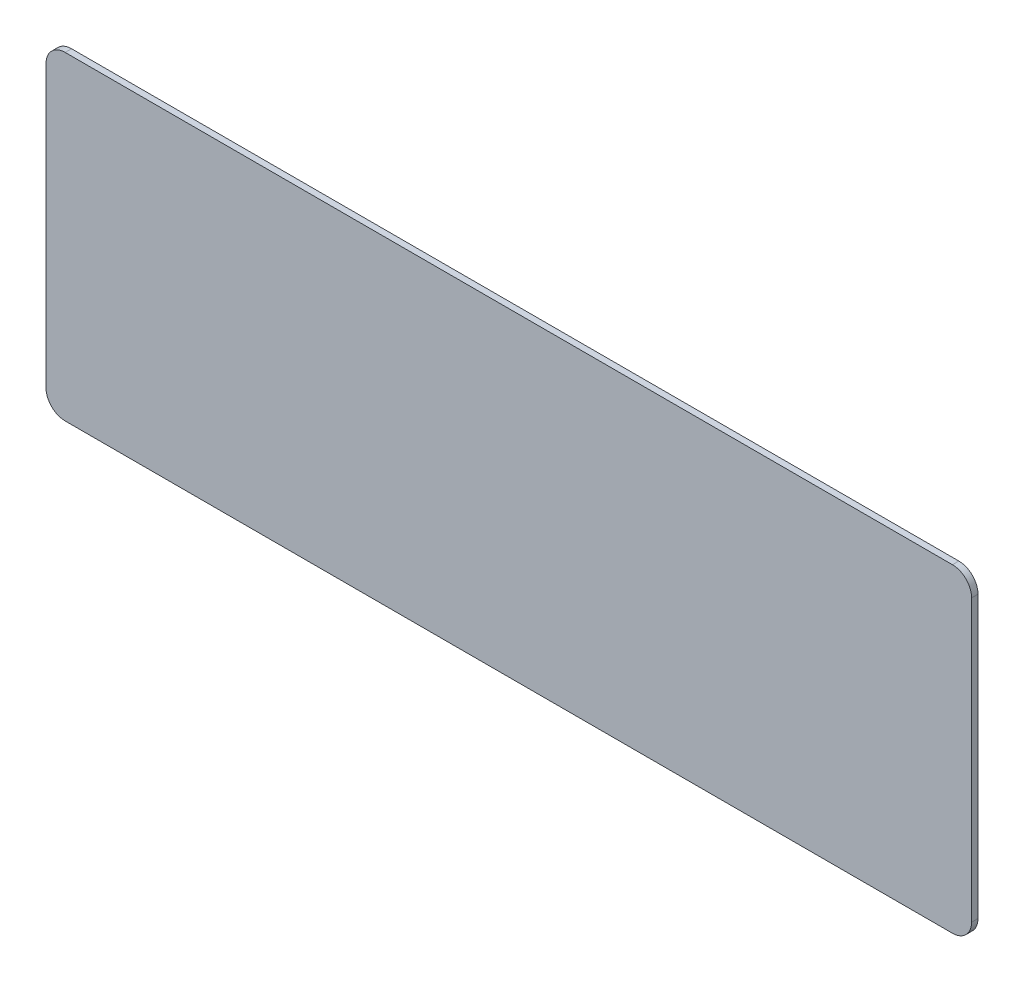
ISO-10303-21;
HEADER;
FILE_DESCRIPTION(('STEP AP214'),'2;1');
FILE_NAME('part.step','',(''),(''),'','','');
FILE_SCHEMA(('AUTOMOTIVE_DESIGN { 1 0 10303 214 1 1 1 1 }'));
ENDSEC;
DATA;
#1=APPLICATION_CONTEXT('core data for automotive mechanical design processes');
#2=APPLICATION_PROTOCOL_DEFINITION('international standard','automotive_design',2000,#1);
#3=PRODUCT_CONTEXT('',#1,'mechanical');
#4=PRODUCT('Part','Part','',(#3));
#5=PRODUCT_RELATED_PRODUCT_CATEGORY('part','',(#4));
#6=PRODUCT_DEFINITION_FORMATION('','',#4);
#7=PRODUCT_DEFINITION_CONTEXT('part definition',#1,'design');
#8=PRODUCT_DEFINITION('design','',#6,#7);
#9=PRODUCT_DEFINITION_SHAPE('','',#8);
#10=(LENGTH_UNIT() NAMED_UNIT(*) SI_UNIT(.MILLI.,.METRE.));
#11=(NAMED_UNIT(*) PLANE_ANGLE_UNIT() SI_UNIT($,.RADIAN.));
#12=(NAMED_UNIT(*) SI_UNIT($,.STERADIAN.) SOLID_ANGLE_UNIT());
#13=UNCERTAINTY_MEASURE_WITH_UNIT(LENGTH_MEASURE(1.E-05),#10,'distance_accuracy_value','');
#14=(GEOMETRIC_REPRESENTATION_CONTEXT(3) GLOBAL_UNCERTAINTY_ASSIGNED_CONTEXT((#13)) GLOBAL_UNIT_ASSIGNED_CONTEXT((#10,
#11,#12)) REPRESENTATION_CONTEXT('',''));
#15=CARTESIAN_POINT('',(0.,0.,0.));
#16=DIRECTION('',(0.,0.,1.));
#17=DIRECTION('',(1.,0.,0.));
#18=AXIS2_PLACEMENT_3D('',#15,#16,#17);
#19=CARTESIAN_POINT('',(72.5,25.,1.));
#20=DIRECTION('',(-1.,0.,0.));
#21=DIRECTION('',(0.,-1.,0.));
#22=AXIS2_PLACEMENT_3D('',#19,#20,#21);
#23=PLANE('',#22);
#24=DIRECTION('',(0.,1.,0.));
#25=VECTOR('',#24,1.);
#26=CARTESIAN_POINT('',(72.5,25.,1.));
#27=LINE('',#26,#25);
#28=CARTESIAN_POINT('',(72.5,-22.,1.));
#29=VERTEX_POINT('',#28);
#30=CARTESIAN_POINT('',(72.5,22.,1.));
#31=VERTEX_POINT('',#30);
#32=EDGE_CURVE('E134',#29,#31,#27,.T.);
#33=ORIENTED_EDGE('',*,*,#32,.F.);
#34=DIRECTION('',(0.,0.,-1.));
#35=VECTOR('',#34,1.);
#36=CARTESIAN_POINT('',(72.5,-22.,1.));
#37=LINE('',#36,#35);
#38=CARTESIAN_POINT('',(72.5,-22.,0.));
#39=VERTEX_POINT('',#38);
#40=EDGE_CURVE('E160',#29,#39,#37,.T.);
#41=ORIENTED_EDGE('',*,*,#40,.T.);
#42=DIRECTION('',(0.,1.,0.));
#43=VECTOR('',#42,1.);
#44=CARTESIAN_POINT('',(72.5,25.,0.));
#45=LINE('',#44,#43);
#46=CARTESIAN_POINT('',(72.5,22.,0.));
#47=VERTEX_POINT('',#46);
#48=EDGE_CURVE('E166',#39,#47,#45,.T.);
#49=ORIENTED_EDGE('',*,*,#48,.T.);
#50=DIRECTION('',(0.,0.,-1.));
#51=VECTOR('',#50,1.);
#52=CARTESIAN_POINT('',(72.5,22.,1.));
#53=LINE('',#52,#51);
#54=EDGE_CURVE('E158',#47,#31,#53,.F.);
#55=ORIENTED_EDGE('',*,*,#54,.T.);
#56=EDGE_LOOP('',(#33,#41,#49,#55));
#57=FACE_BOUND('',#56,.T.);
#58=ADVANCED_FACE('F42',(#57),#23,.F.);
#59=CARTESIAN_POINT('',(-72.5,25.,1.));
#60=DIRECTION('',(0.,-1.,0.));
#61=DIRECTION('',(0.,0.,-1.));
#62=AXIS2_PLACEMENT_3D('',#59,#60,#61);
#63=PLANE('',#62);
#64=DIRECTION('',(-1.,0.,0.));
#65=VECTOR('',#64,1.);
#66=CARTESIAN_POINT('',(-72.5,25.,1.));
#67=LINE('',#66,#65);
#68=CARTESIAN_POINT('',(69.5,25.,1.));
#69=VERTEX_POINT('',#68);
#70=CARTESIAN_POINT('',(-69.5,25.,1.));
#71=VERTEX_POINT('',#70);
#72=EDGE_CURVE('E137',#69,#71,#67,.T.);
#73=ORIENTED_EDGE('',*,*,#72,.F.);
#74=DIRECTION('',(0.,0.,-1.));
#75=VECTOR('',#74,1.);
#76=CARTESIAN_POINT('',(69.5,25.,1.));
#77=LINE('',#76,#75);
#78=CARTESIAN_POINT('',(69.5,25.,0.));
#79=VERTEX_POINT('',#78);
#80=EDGE_CURVE('E11',#69,#79,#77,.T.);
#81=ORIENTED_EDGE('',*,*,#80,.T.);
#82=DIRECTION('',(-1.,0.,0.));
#83=VECTOR('',#82,1.);
#84=CARTESIAN_POINT('',(-72.5,25.,0.));
#85=LINE('',#84,#83);
#86=CARTESIAN_POINT('',(-69.5,25.,0.));
#87=VERTEX_POINT('',#86);
#88=EDGE_CURVE('E139',#79,#87,#85,.T.);
#89=ORIENTED_EDGE('',*,*,#88,.T.);
#90=DIRECTION('',(0.,0.,-1.));
#91=VECTOR('',#90,1.);
#92=CARTESIAN_POINT('',(-69.5,25.,1.));
#93=LINE('',#92,#91);
#94=EDGE_CURVE('E50',#87,#71,#93,.F.);
#95=ORIENTED_EDGE('',*,*,#94,.T.);
#96=EDGE_LOOP('',(#73,#81,#89,#95));
#97=FACE_BOUND('',#96,.T.);
#98=ADVANCED_FACE('F185',(#97),#63,.F.);
#99=CARTESIAN_POINT('',(-72.5,25.,1.));
#100=DIRECTION('',(1.,0.,0.));
#101=DIRECTION('',(0.,0.,-1.));
#102=AXIS2_PLACEMENT_3D('',#99,#100,#101);
#103=PLANE('',#102);
#104=DIRECTION('',(0.,-1.,0.));
#105=VECTOR('',#104,1.);
#106=CARTESIAN_POINT('',(-72.5,25.,0.));
#107=LINE('',#106,#105);
#108=CARTESIAN_POINT('',(-72.5,22.,0.));
#109=VERTEX_POINT('',#108);
#110=CARTESIAN_POINT('',(-72.5,-22.,0.));
#111=VERTEX_POINT('',#110);
#112=EDGE_CURVE('E135',#109,#111,#107,.T.);
#113=ORIENTED_EDGE('',*,*,#112,.T.);
#114=DIRECTION('',(0.,0.,-1.));
#115=VECTOR('',#114,1.);
#116=CARTESIAN_POINT('',(-72.5,-22.,1.));
#117=LINE('',#116,#115);
#118=CARTESIAN_POINT('',(-72.5,-22.,1.));
#119=VERTEX_POINT('',#118);
#120=EDGE_CURVE('E113',#111,#119,#117,.F.);
#121=ORIENTED_EDGE('',*,*,#120,.T.);
#122=DIRECTION('',(0.,-1.,0.));
#123=VECTOR('',#122,1.);
#124=CARTESIAN_POINT('',(-72.5,25.,1.));
#125=LINE('',#124,#123);
#126=CARTESIAN_POINT('',(-72.5,22.,1.));
#127=VERTEX_POINT('',#126);
#128=EDGE_CURVE('E174',#127,#119,#125,.T.);
#129=ORIENTED_EDGE('',*,*,#128,.F.);
#130=DIRECTION('',(0.,0.,-1.));
#131=VECTOR('',#130,1.);
#132=CARTESIAN_POINT('',(-72.5,22.,1.));
#133=LINE('',#132,#131);
#134=EDGE_CURVE('E118',#127,#109,#133,.T.);
#135=ORIENTED_EDGE('',*,*,#134,.T.);
#136=EDGE_LOOP('',(#113,#121,#129,#135));
#137=FACE_BOUND('',#136,.T.);
#138=ADVANCED_FACE('F184',(#137),#103,.F.);
#139=CARTESIAN_POINT('',(-72.5,-25.,1.));
#140=DIRECTION('',(0.,1.,0.));
#141=DIRECTION('',(0.,0.,1.));
#142=AXIS2_PLACEMENT_3D('',#139,#140,#141);
#143=PLANE('',#142);
#144=DIRECTION('',(1.,0.,0.));
#145=VECTOR('',#144,1.);
#146=CARTESIAN_POINT('',(-72.5,-25.,1.));
#147=LINE('',#146,#145);
#148=CARTESIAN_POINT('',(-69.5,-25.,1.));
#149=VERTEX_POINT('',#148);
#150=CARTESIAN_POINT('',(69.5,-25.,1.));
#151=VERTEX_POINT('',#150);
#152=EDGE_CURVE('E128',#149,#151,#147,.T.);
#153=ORIENTED_EDGE('',*,*,#152,.F.);
#154=DIRECTION('',(0.,0.,-1.));
#155=VECTOR('',#154,1.);
#156=CARTESIAN_POINT('',(-69.5,-25.,1.));
#157=LINE('',#156,#155);
#158=CARTESIAN_POINT('',(-69.5,-25.,0.));
#159=VERTEX_POINT('',#158);
#160=EDGE_CURVE('E112',#149,#159,#157,.T.);
#161=ORIENTED_EDGE('',*,*,#160,.T.);
#162=DIRECTION('',(1.,0.,0.));
#163=VECTOR('',#162,1.);
#164=CARTESIAN_POINT('',(-72.5,-25.,0.));
#165=LINE('',#164,#163);
#166=CARTESIAN_POINT('',(69.5,-25.,0.));
#167=VERTEX_POINT('',#166);
#168=EDGE_CURVE('E125',#159,#167,#165,.T.);
#169=ORIENTED_EDGE('',*,*,#168,.T.);
#170=DIRECTION('',(0.,0.,-1.));
#171=VECTOR('',#170,1.);
#172=CARTESIAN_POINT('',(69.5,-25.,1.));
#173=LINE('',#172,#171);
#174=EDGE_CURVE('E130',#167,#151,#173,.F.);
#175=ORIENTED_EDGE('',*,*,#174,.T.);
#176=EDGE_LOOP('',(#153,#161,#169,#175));
#177=FACE_BOUND('',#176,.T.);
#178=ADVANCED_FACE('F124',(#177),#143,.F.);
#179=CARTESIAN_POINT('',(0.,0.,1.));
#180=DIRECTION('',(0.,0.,1.));
#181=DIRECTION('',(1.,0.,0.));
#182=AXIS2_PLACEMENT_3D('',#179,#180,#181);
#183=PLANE('',#182);
#184=ORIENTED_EDGE('',*,*,#128,.T.);
#185=CARTESIAN_POINT('',(-69.5,-22.,1.));
#186=DIRECTION('',(0.,0.,1.));
#187=DIRECTION('',(1.,0.,0.));
#188=AXIS2_PLACEMENT_3D('',#185,#186,#187);
#189=CIRCLE('',#188,3.);
#190=EDGE_CURVE('E156',#119,#149,#189,.T.);
#191=ORIENTED_EDGE('',*,*,#190,.T.);
#192=ORIENTED_EDGE('',*,*,#152,.T.);
#193=CARTESIAN_POINT('',(69.5,-22.,1.));
#194=DIRECTION('',(0.,0.,1.));
#195=DIRECTION('',(1.,0.,0.));
#196=AXIS2_PLACEMENT_3D('',#193,#194,#195);
#197=CIRCLE('',#196,3.);
#198=EDGE_CURVE('E154',#151,#29,#197,.T.);
#199=ORIENTED_EDGE('',*,*,#198,.T.);
#200=ORIENTED_EDGE('',*,*,#32,.T.);
#201=CARTESIAN_POINT('',(69.5,22.,1.));
#202=DIRECTION('',(0.,0.,1.));
#203=DIRECTION('',(1.,0.,0.));
#204=AXIS2_PLACEMENT_3D('',#201,#202,#203);
#205=CIRCLE('',#204,3.);
#206=EDGE_CURVE('E63',#31,#69,#205,.T.);
#207=ORIENTED_EDGE('',*,*,#206,.T.);
#208=ORIENTED_EDGE('',*,*,#72,.T.);
#209=CARTESIAN_POINT('',(-69.5,22.,1.));
#210=DIRECTION('',(0.,0.,1.));
#211=DIRECTION('',(1.,0.,0.));
#212=AXIS2_PLACEMENT_3D('',#209,#210,#211);
#213=CIRCLE('',#212,3.);
#214=EDGE_CURVE('E151',#71,#127,#213,.T.);
#215=ORIENTED_EDGE('',*,*,#214,.T.);
#216=EDGE_LOOP('',(#184,#191,#192,#199,#200,#207,#208,#215));
#217=FACE_BOUND('',#216,.T.);
#218=ADVANCED_FACE('F178',(#217),#183,.T.);
#219=CARTESIAN_POINT('',(0.,0.,0.));
#220=DIRECTION('',(0.,0.,1.));
#221=DIRECTION('',(1.,0.,0.));
#222=AXIS2_PLACEMENT_3D('',#219,#220,#221);
#223=PLANE('',#222);
#224=ORIENTED_EDGE('',*,*,#168,.F.);
#225=CARTESIAN_POINT('',(-69.5,-22.,0.));
#226=DIRECTION('',(0.,0.,1.));
#227=DIRECTION('',(1.,0.,0.));
#228=AXIS2_PLACEMENT_3D('',#225,#226,#227);
#229=CIRCLE('',#228,3.);
#230=EDGE_CURVE('E108',#159,#111,#229,.F.);
#231=ORIENTED_EDGE('',*,*,#230,.T.);
#232=ORIENTED_EDGE('',*,*,#112,.F.);
#233=CARTESIAN_POINT('',(-69.5,22.,0.));
#234=DIRECTION('',(0.,0.,1.));
#235=DIRECTION('',(1.,0.,0.));
#236=AXIS2_PLACEMENT_3D('',#233,#234,#235);
#237=CIRCLE('',#236,3.);
#238=EDGE_CURVE('E129',#109,#87,#237,.F.);
#239=ORIENTED_EDGE('',*,*,#238,.T.);
#240=ORIENTED_EDGE('',*,*,#88,.F.);
#241=CARTESIAN_POINT('',(69.5,22.,0.));
#242=DIRECTION('',(0.,0.,1.));
#243=DIRECTION('',(1.,0.,0.));
#244=AXIS2_PLACEMENT_3D('',#241,#242,#243);
#245=CIRCLE('',#244,3.);
#246=EDGE_CURVE('E145',#79,#47,#245,.F.);
#247=ORIENTED_EDGE('',*,*,#246,.T.);
#248=ORIENTED_EDGE('',*,*,#48,.F.);
#249=CARTESIAN_POINT('',(69.5,-22.,0.));
#250=DIRECTION('',(0.,0.,1.));
#251=DIRECTION('',(1.,0.,0.));
#252=AXIS2_PLACEMENT_3D('',#249,#250,#251);
#253=CIRCLE('',#252,3.);
#254=EDGE_CURVE('E119',#39,#167,#253,.F.);
#255=ORIENTED_EDGE('',*,*,#254,.T.);
#256=EDGE_LOOP('',(#224,#231,#232,#239,#240,#247,#248,#255));
#257=FACE_BOUND('',#256,.T.);
#258=ADVANCED_FACE('F132',(#257),#223,.F.);
#259=CARTESIAN_POINT('',(-69.5,-22.,1.));
#260=DIRECTION('',(0.,0.,-1.));
#261=DIRECTION('',(-1.,0.,0.));
#262=AXIS2_PLACEMENT_3D('',#259,#260,#261);
#263=CYLINDRICAL_SURFACE('',#262,3.);
#264=ORIENTED_EDGE('',*,*,#190,.F.);
#265=ORIENTED_EDGE('',*,*,#120,.F.);
#266=ORIENTED_EDGE('',*,*,#230,.F.);
#267=ORIENTED_EDGE('',*,*,#160,.F.);
#268=EDGE_LOOP('',(#264,#265,#266,#267));
#269=FACE_BOUND('',#268,.T.);
#270=ADVANCED_FACE('F111',(#269),#263,.T.);
#271=CARTESIAN_POINT('',(69.5,-22.,1.));
#272=DIRECTION('',(0.,0.,-1.));
#273=DIRECTION('',(-1.,0.,0.));
#274=AXIS2_PLACEMENT_3D('',#271,#272,#273);
#275=CYLINDRICAL_SURFACE('',#274,3.);
#276=ORIENTED_EDGE('',*,*,#198,.F.);
#277=ORIENTED_EDGE('',*,*,#174,.F.);
#278=ORIENTED_EDGE('',*,*,#254,.F.);
#279=ORIENTED_EDGE('',*,*,#40,.F.);
#280=EDGE_LOOP('',(#276,#277,#278,#279));
#281=FACE_BOUND('',#280,.T.);
#282=ADVANCED_FACE('F188',(#281),#275,.T.);
#283=CARTESIAN_POINT('',(69.5,22.,1.));
#284=DIRECTION('',(0.,0.,-1.));
#285=DIRECTION('',(-1.,0.,0.));
#286=AXIS2_PLACEMENT_3D('',#283,#284,#285);
#287=CYLINDRICAL_SURFACE('',#286,3.);
#288=ORIENTED_EDGE('',*,*,#206,.F.);
#289=ORIENTED_EDGE('',*,*,#54,.F.);
#290=ORIENTED_EDGE('',*,*,#246,.F.);
#291=ORIENTED_EDGE('',*,*,#80,.F.);
#292=EDGE_LOOP('',(#288,#289,#290,#291));
#293=FACE_BOUND('',#292,.T.);
#294=ADVANCED_FACE('F187',(#293),#287,.T.);
#295=CARTESIAN_POINT('',(-69.5,22.,1.));
#296=DIRECTION('',(0.,0.,-1.));
#297=DIRECTION('',(-1.,0.,0.));
#298=AXIS2_PLACEMENT_3D('',#295,#296,#297);
#299=CYLINDRICAL_SURFACE('',#298,3.);
#300=ORIENTED_EDGE('',*,*,#214,.F.);
#301=ORIENTED_EDGE('',*,*,#94,.F.);
#302=ORIENTED_EDGE('',*,*,#238,.F.);
#303=ORIENTED_EDGE('',*,*,#134,.F.);
#304=EDGE_LOOP('',(#300,#301,#302,#303));
#305=FACE_BOUND('',#304,.T.);
#306=ADVANCED_FACE('F44',(#305),#299,.T.);
#307=CLOSED_SHELL('',(#58,#98,#138,#178,#218,#258,#270,#282,#294,#306));
#308=MANIFOLD_SOLID_BREP('B2',#307);
#309=ADVANCED_BREP_SHAPE_REPRESENTATION('',(#18,#308),#14);
#310=SHAPE_DEFINITION_REPRESENTATION(#9,#309);
ENDSEC;
END-ISO-10303-21;
